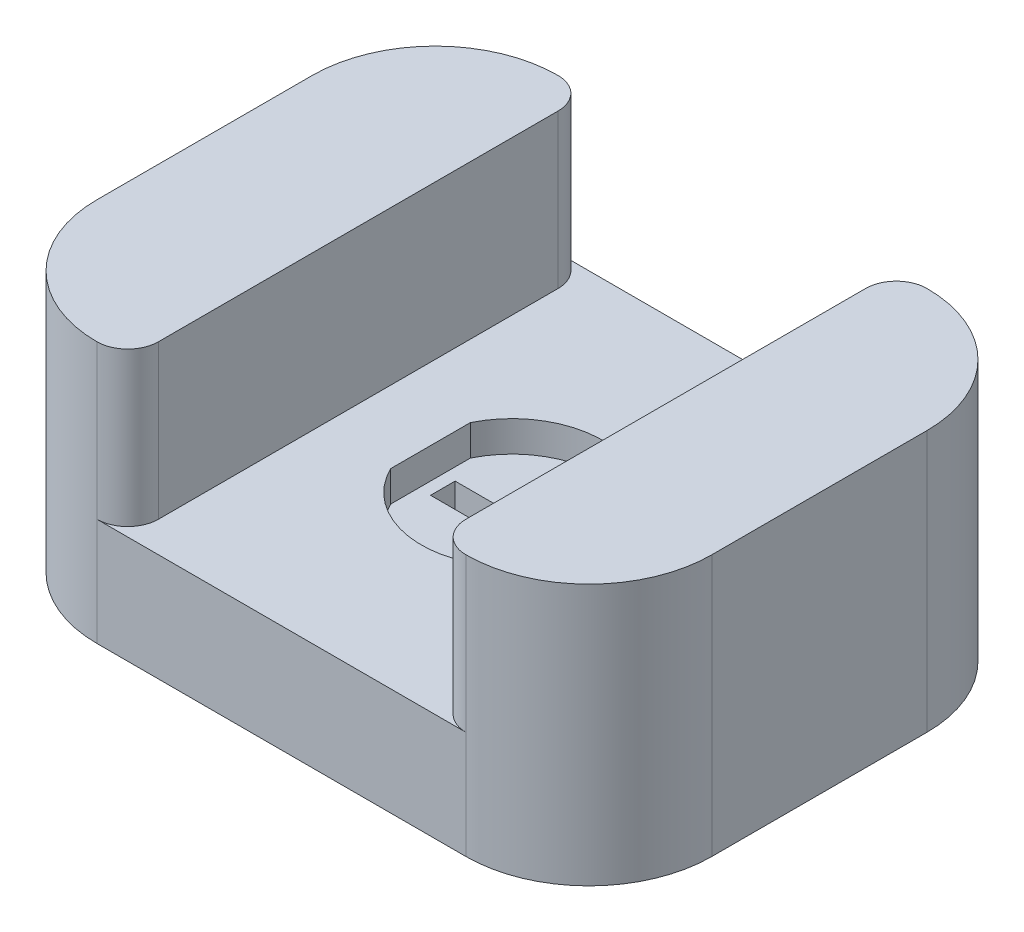
ISO-10303-21;
HEADER;
FILE_DESCRIPTION(('STEP AP214'),'2;1');
FILE_NAME('part.step','',(''),(''),'','','');
FILE_SCHEMA(('AUTOMOTIVE_DESIGN { 1 0 10303 214 1 1 1 1 }'));
ENDSEC;
DATA;
#1=APPLICATION_CONTEXT('core data for automotive mechanical design processes');
#2=APPLICATION_PROTOCOL_DEFINITION('international standard','automotive_design',2000,#1);
#3=PRODUCT_CONTEXT('',#1,'mechanical');
#4=PRODUCT('Part','Part','',(#3));
#5=PRODUCT_RELATED_PRODUCT_CATEGORY('part','',(#4));
#6=PRODUCT_DEFINITION_FORMATION('','',#4);
#7=PRODUCT_DEFINITION_CONTEXT('part definition',#1,'design');
#8=PRODUCT_DEFINITION('design','',#6,#7);
#9=PRODUCT_DEFINITION_SHAPE('','',#8);
#10=(LENGTH_UNIT() NAMED_UNIT(*) SI_UNIT(.MILLI.,.METRE.));
#11=(NAMED_UNIT(*) PLANE_ANGLE_UNIT() SI_UNIT($,.RADIAN.));
#12=(NAMED_UNIT(*) SI_UNIT($,.STERADIAN.) SOLID_ANGLE_UNIT());
#13=UNCERTAINTY_MEASURE_WITH_UNIT(LENGTH_MEASURE(1.E-05),#10,'distance_accuracy_value','');
#14=(GEOMETRIC_REPRESENTATION_CONTEXT(3) GLOBAL_UNCERTAINTY_ASSIGNED_CONTEXT((#13)) GLOBAL_UNIT_ASSIGNED_CONTEXT((#10,
#11,#12)) REPRESENTATION_CONTEXT('',''));
#15=CARTESIAN_POINT('',(0.,0.,0.));
#16=DIRECTION('',(0.,0.,1.));
#17=DIRECTION('',(1.,0.,0.));
#18=AXIS2_PLACEMENT_3D('',#15,#16,#17);
#19=CARTESIAN_POINT('',(0.,3.5,0.));
#20=DIRECTION('',(0.,1.,0.));
#21=DIRECTION('',(0.,0.,1.));
#22=AXIS2_PLACEMENT_3D('',#19,#20,#21);
#23=PLANE('',#22);
#24=CARTESIAN_POINT('',(0.,3.5,0.));
#25=DIRECTION('',(0.,1.,0.));
#26=DIRECTION('',(0.,0.,1.));
#27=AXIS2_PLACEMENT_3D('',#24,#25,#26);
#28=CIRCLE('',#27,2.95);
#29=CARTESIAN_POINT('',(-2.65,3.5,1.29614813968157));
#30=VERTEX_POINT('',#29);
#31=CARTESIAN_POINT('',(-2.65,3.5,-1.29614813968157));
#32=VERTEX_POINT('',#31);
#33=EDGE_CURVE('E279',#30,#32,#28,.T.);
#34=ORIENTED_EDGE('',*,*,#33,.F.);
#35=DIRECTION('',(0.,0.,1.));
#36=VECTOR('',#35,1.);
#37=CARTESIAN_POINT('',(-2.65,3.5,1.29614813968157));
#38=LINE('',#37,#36);
#39=EDGE_CURVE('E284',#32,#30,#38,.T.);
#40=ORIENTED_EDGE('',*,*,#39,.F.);
#41=EDGE_LOOP('',(#34,#40));
#42=FACE_BOUND('',#41,.T.);
#43=DIRECTION('',(-1.,0.,0.));
#44=VECTOR('',#43,1.);
#45=CARTESIAN_POINT('',(10.,3.5,-7.5));
#46=LINE('',#45,#44);
#47=CARTESIAN_POINT('',(6.,3.5,-7.5));
#48=VERTEX_POINT('',#47);
#49=CARTESIAN_POINT('',(-6.,3.5,-7.5));
#50=VERTEX_POINT('',#49);
#51=EDGE_CURVE('E298',#48,#50,#46,.T.);
#52=ORIENTED_EDGE('',*,*,#51,.T.);
#53=CARTESIAN_POINT('',(-6.00000000000001,3.5,-6.5));
#54=DIRECTION('',(0.,1.,0.));
#55=DIRECTION('',(0.,0.,1.));
#56=AXIS2_PLACEMENT_3D('',#53,#54,#55);
#57=CIRCLE('',#56,1.);
#58=CARTESIAN_POINT('',(-5.00000000000001,3.5,-6.5));
#59=VERTEX_POINT('',#58);
#60=EDGE_CURVE('E41',#50,#59,#57,.F.);
#61=ORIENTED_EDGE('',*,*,#60,.T.);
#62=DIRECTION('',(0.,0.,-1.));
#63=VECTOR('',#62,1.);
#64=CARTESIAN_POINT('',(-5.00000000000001,3.5,-7.5));
#65=LINE('',#64,#63);
#66=CARTESIAN_POINT('',(-5.,3.5,6.5));
#67=VERTEX_POINT('',#66);
#68=EDGE_CURVE('E216',#67,#59,#65,.T.);
#69=ORIENTED_EDGE('',*,*,#68,.F.);
#70=CARTESIAN_POINT('',(-6.,3.5,6.5));
#71=DIRECTION('',(0.,1.,0.));
#72=DIRECTION('',(0.,0.,1.));
#73=AXIS2_PLACEMENT_3D('',#70,#71,#72);
#74=CIRCLE('',#73,1.);
#75=CARTESIAN_POINT('',(-6.,3.5,7.5));
#76=VERTEX_POINT('',#75);
#77=EDGE_CURVE('E11',#67,#76,#74,.F.);
#78=ORIENTED_EDGE('',*,*,#77,.T.);
#79=DIRECTION('',(1.,0.,0.));
#80=VECTOR('',#79,1.);
#81=CARTESIAN_POINT('',(10.,3.5,7.5));
#82=LINE('',#81,#80);
#83=CARTESIAN_POINT('',(6.,3.5,7.5));
#84=VERTEX_POINT('',#83);
#85=EDGE_CURVE('E296',#76,#84,#82,.T.);
#86=ORIENTED_EDGE('',*,*,#85,.T.);
#87=CARTESIAN_POINT('',(6.,3.5,6.5));
#88=DIRECTION('',(0.,1.,0.));
#89=DIRECTION('',(0.,0.,1.));
#90=AXIS2_PLACEMENT_3D('',#87,#88,#89);
#91=CIRCLE('',#90,1.);
#92=CARTESIAN_POINT('',(5.,3.5,6.5));
#93=VERTEX_POINT('',#92);
#94=EDGE_CURVE('E366',#84,#93,#91,.F.);
#95=ORIENTED_EDGE('',*,*,#94,.T.);
#96=DIRECTION('',(0.,0.,1.));
#97=VECTOR('',#96,1.);
#98=CARTESIAN_POINT('',(5.,3.5,-7.5));
#99=LINE('',#98,#97);
#100=CARTESIAN_POINT('',(5.,3.5,-6.5));
#101=VERTEX_POINT('',#100);
#102=EDGE_CURVE('E222',#101,#93,#99,.T.);
#103=ORIENTED_EDGE('',*,*,#102,.F.);
#104=CARTESIAN_POINT('',(6.,3.5,-6.5));
#105=DIRECTION('',(0.,1.,0.));
#106=DIRECTION('',(0.,0.,1.));
#107=AXIS2_PLACEMENT_3D('',#104,#105,#106);
#108=CIRCLE('',#107,1.);
#109=EDGE_CURVE('E363',#101,#48,#108,.F.);
#110=ORIENTED_EDGE('',*,*,#109,.T.);
#111=EDGE_LOOP('',(#52,#61,#69,#78,#86,#95,#103,#110));
#112=FACE_BOUND('',#111,.T.);
#113=ADVANCED_FACE('F33',(#42,#112),#23,.T.);
#114=CARTESIAN_POINT('',(2.25,-0.00100000000000013,-0.4));
#115=DIRECTION('',(0.,0.,-1.));
#116=DIRECTION('',(-1.,0.,0.));
#117=AXIS2_PLACEMENT_3D('',#114,#115,#116);
#118=PLANE('',#117);
#119=DIRECTION('',(0.,1.,0.));
#120=VECTOR('',#119,1.);
#121=CARTESIAN_POINT('',(-2.25,-0.00100000000000013,-0.4));
#122=LINE('',#121,#120);
#123=CARTESIAN_POINT('',(-2.25,1.4,-0.4));
#124=VERTEX_POINT('',#123);
#125=CARTESIAN_POINT('',(-2.25,2.5,-0.4));
#126=VERTEX_POINT('',#125);
#127=EDGE_CURVE('E269',#124,#126,#122,.T.);
#128=ORIENTED_EDGE('',*,*,#127,.F.);
#129=DIRECTION('',(-1.,0.,0.));
#130=VECTOR('',#129,1.);
#131=CARTESIAN_POINT('',(2.25,1.4,-0.4));
#132=LINE('',#131,#130);
#133=CARTESIAN_POINT('',(2.25,1.4,-0.4));
#134=VERTEX_POINT('',#133);
#135=EDGE_CURVE('E342',#124,#134,#132,.F.);
#136=ORIENTED_EDGE('',*,*,#135,.T.);
#137=DIRECTION('',(0.,1.,0.));
#138=VECTOR('',#137,1.);
#139=CARTESIAN_POINT('',(2.25,-0.00100000000000013,-0.4));
#140=LINE('',#139,#138);
#141=CARTESIAN_POINT('',(2.25,2.5,-0.4));
#142=VERTEX_POINT('',#141);
#143=EDGE_CURVE('E272',#134,#142,#140,.T.);
#144=ORIENTED_EDGE('',*,*,#143,.T.);
#145=DIRECTION('',(-1.,0.,0.));
#146=VECTOR('',#145,1.);
#147=CARTESIAN_POINT('',(2.25,2.5,-0.4));
#148=LINE('',#147,#146);
#149=EDGE_CURVE('E265',#142,#126,#148,.T.);
#150=ORIENTED_EDGE('',*,*,#149,.T.);
#151=EDGE_LOOP('',(#128,#136,#144,#150));
#152=FACE_BOUND('',#151,.T.);
#153=ADVANCED_FACE('F441',(#152),#118,.F.);
#154=CARTESIAN_POINT('',(-10.,3.5,7.5));
#155=DIRECTION('',(1.,0.,0.));
#156=DIRECTION('',(0.,0.,-1.));
#157=AXIS2_PLACEMENT_3D('',#154,#155,#156);
#158=PLANE('',#157);
#159=DIRECTION('',(0.,-1.,0.));
#160=VECTOR('',#159,1.);
#161=CARTESIAN_POINT('',(-10.,3.5,3.5));
#162=LINE('',#161,#160);
#163=CARTESIAN_POINT('',(-10.,0.,3.5));
#164=VERTEX_POINT('',#163);
#165=CARTESIAN_POINT('',(-10.,8.5,3.5));
#166=VERTEX_POINT('',#165);
#167=EDGE_CURVE('E204',#164,#166,#162,.F.);
#168=ORIENTED_EDGE('',*,*,#167,.T.);
#169=DIRECTION('',(0.,0.,1.));
#170=VECTOR('',#169,1.);
#171=CARTESIAN_POINT('',(-10.,8.5,-3.5));
#172=LINE('',#171,#170);
#173=CARTESIAN_POINT('',(-10.,8.5,-3.5));
#174=VERTEX_POINT('',#173);
#175=EDGE_CURVE('E207',#174,#166,#172,.T.);
#176=ORIENTED_EDGE('',*,*,#175,.F.);
#177=DIRECTION('',(0.,-1.,0.));
#178=VECTOR('',#177,1.);
#179=CARTESIAN_POINT('',(-10.,3.5,-3.5));
#180=LINE('',#179,#178);
#181=CARTESIAN_POINT('',(-10.,0.,-3.5));
#182=VERTEX_POINT('',#181);
#183=EDGE_CURVE('E190',#174,#182,#180,.T.);
#184=ORIENTED_EDGE('',*,*,#183,.T.);
#185=DIRECTION('',(0.,0.,1.));
#186=VECTOR('',#185,1.);
#187=CARTESIAN_POINT('',(-10.,0.,7.5));
#188=LINE('',#187,#186);
#189=EDGE_CURVE('E293',#182,#164,#188,.T.);
#190=ORIENTED_EDGE('',*,*,#189,.T.);
#191=EDGE_LOOP('',(#168,#176,#184,#190));
#192=FACE_BOUND('',#191,.T.);
#193=ADVANCED_FACE('F208',(#192),#158,.F.);
#194=CARTESIAN_POINT('',(10.,3.5,7.5));
#195=DIRECTION('',(0.,0.,-1.));
#196=DIRECTION('',(-1.,0.,0.));
#197=AXIS2_PLACEMENT_3D('',#194,#195,#196);
#198=PLANE('',#197);
#199=DIRECTION('',(0.,-1.,0.));
#200=VECTOR('',#199,1.);
#201=CARTESIAN_POINT('',(6.,3.5,7.5));
#202=LINE('',#201,#200);
#203=CARTESIAN_POINT('',(6.,0.,7.5));
#204=VERTEX_POINT('',#203);
#205=EDGE_CURVE('E336',#204,#84,#202,.F.);
#206=ORIENTED_EDGE('',*,*,#205,.T.);
#207=ORIENTED_EDGE('',*,*,#85,.F.);
#208=DIRECTION('',(0.,-1.,0.));
#209=VECTOR('',#208,1.);
#210=CARTESIAN_POINT('',(-6.,3.5,7.5));
#211=LINE('',#210,#209);
#212=CARTESIAN_POINT('',(-6.,0.,7.5));
#213=VERTEX_POINT('',#212);
#214=EDGE_CURVE('E331',#76,#213,#211,.T.);
#215=ORIENTED_EDGE('',*,*,#214,.T.);
#216=DIRECTION('',(1.,0.,0.));
#217=VECTOR('',#216,1.);
#218=CARTESIAN_POINT('',(10.,0.,7.5));
#219=LINE('',#218,#217);
#220=EDGE_CURVE('E302',#213,#204,#219,.T.);
#221=ORIENTED_EDGE('',*,*,#220,.T.);
#222=EDGE_LOOP('',(#206,#207,#215,#221));
#223=FACE_BOUND('',#222,.T.);
#224=ADVANCED_FACE('F390',(#223),#198,.F.);
#225=CARTESIAN_POINT('',(10.,3.5,7.5));
#226=DIRECTION('',(-1.,0.,0.));
#227=DIRECTION('',(0.,0.,1.));
#228=AXIS2_PLACEMENT_3D('',#225,#226,#227);
#229=PLANE('',#228);
#230=DIRECTION('',(0.,0.,-1.));
#231=VECTOR('',#230,1.);
#232=CARTESIAN_POINT('',(10.,0.,7.5));
#233=LINE('',#232,#231);
#234=CARTESIAN_POINT('',(10.,0.,3.5));
#235=VERTEX_POINT('',#234);
#236=CARTESIAN_POINT('',(10.,0.,-3.5));
#237=VERTEX_POINT('',#236);
#238=EDGE_CURVE('E305',#235,#237,#233,.T.);
#239=ORIENTED_EDGE('',*,*,#238,.T.);
#240=DIRECTION('',(0.,-1.,0.));
#241=VECTOR('',#240,1.);
#242=CARTESIAN_POINT('',(10.,3.5,-3.5));
#243=LINE('',#242,#241);
#244=CARTESIAN_POINT('',(10.,8.5,-3.5));
#245=VERTEX_POINT('',#244);
#246=EDGE_CURVE('E329',#237,#245,#243,.F.);
#247=ORIENTED_EDGE('',*,*,#246,.T.);
#248=DIRECTION('',(0.,0.,-1.));
#249=VECTOR('',#248,1.);
#250=CARTESIAN_POINT('',(10.,8.5,3.5));
#251=LINE('',#250,#249);
#252=CARTESIAN_POINT('',(10.,8.5,3.5));
#253=VERTEX_POINT('',#252);
#254=EDGE_CURVE('E233',#253,#245,#251,.T.);
#255=ORIENTED_EDGE('',*,*,#254,.F.);
#256=DIRECTION('',(0.,-1.,0.));
#257=VECTOR('',#256,1.);
#258=CARTESIAN_POINT('',(10.,3.5,3.5));
#259=LINE('',#258,#257);
#260=EDGE_CURVE('E326',#253,#235,#259,.T.);
#261=ORIENTED_EDGE('',*,*,#260,.T.);
#262=EDGE_LOOP('',(#239,#247,#255,#261));
#263=FACE_BOUND('',#262,.T.);
#264=ADVANCED_FACE('F475',(#263),#229,.F.);
#265=CARTESIAN_POINT('',(10.,3.5,-7.5));
#266=DIRECTION('',(0.,0.,1.));
#267=DIRECTION('',(1.,0.,0.));
#268=AXIS2_PLACEMENT_3D('',#265,#266,#267);
#269=PLANE('',#268);
#270=ORIENTED_EDGE('',*,*,#51,.F.);
#271=DIRECTION('',(0.,-1.,0.));
#272=VECTOR('',#271,1.);
#273=CARTESIAN_POINT('',(6.,3.5,-7.5));
#274=LINE('',#273,#272);
#275=CARTESIAN_POINT('',(6.,0.,-7.5));
#276=VERTEX_POINT('',#275);
#277=EDGE_CURVE('E318',#48,#276,#274,.T.);
#278=ORIENTED_EDGE('',*,*,#277,.T.);
#279=DIRECTION('',(-1.,0.,0.));
#280=VECTOR('',#279,1.);
#281=CARTESIAN_POINT('',(10.,0.,-7.5));
#282=LINE('',#281,#280);
#283=CARTESIAN_POINT('',(2.25,0.,-7.5));
#284=VERTEX_POINT('',#283);
#285=EDGE_CURVE('E299',#276,#284,#282,.T.);
#286=ORIENTED_EDGE('',*,*,#285,.T.);
#287=DIRECTION('',(0.,-1.,0.));
#288=VECTOR('',#287,1.);
#289=CARTESIAN_POINT('',(2.25,0.4,-7.5));
#290=LINE('',#289,#288);
#291=CARTESIAN_POINT('',(2.25,0.4,-7.5));
#292=VERTEX_POINT('',#291);
#293=EDGE_CURVE('E247',#292,#284,#290,.T.);
#294=ORIENTED_EDGE('',*,*,#293,.F.);
#295=DIRECTION('',(1.,0.,0.));
#296=VECTOR('',#295,1.);
#297=CARTESIAN_POINT('',(-2.25,0.4,-7.5));
#298=LINE('',#297,#296);
#299=CARTESIAN_POINT('',(-2.25,0.4,-7.5));
#300=VERTEX_POINT('',#299);
#301=EDGE_CURVE('E240',#300,#292,#298,.T.);
#302=ORIENTED_EDGE('',*,*,#301,.F.);
#303=DIRECTION('',(0.,-1.,0.));
#304=VECTOR('',#303,1.);
#305=CARTESIAN_POINT('',(-2.25,0.4,-7.5));
#306=LINE('',#305,#304);
#307=CARTESIAN_POINT('',(-2.25,0.,-7.5));
#308=VERTEX_POINT('',#307);
#309=EDGE_CURVE('E246',#300,#308,#306,.T.);
#310=ORIENTED_EDGE('',*,*,#309,.T.);
#311=CARTESIAN_POINT('',(-6.,0.,-7.5));
#312=VERTEX_POINT('',#311);
#313=EDGE_CURVE('E308',#308,#312,#282,.T.);
#314=ORIENTED_EDGE('',*,*,#313,.T.);
#315=DIRECTION('',(0.,-1.,0.));
#316=VECTOR('',#315,1.);
#317=CARTESIAN_POINT('',(-6.,3.5,-7.5));
#318=LINE('',#317,#316);
#319=EDGE_CURVE('E323',#312,#50,#318,.F.);
#320=ORIENTED_EDGE('',*,*,#319,.T.);
#321=EDGE_LOOP('',(#270,#278,#286,#294,#302,#310,#314,#320));
#322=FACE_BOUND('',#321,.T.);
#323=ADVANCED_FACE('F375',(#322),#269,.F.);
#324=CARTESIAN_POINT('',(0.,0.,0.));
#325=DIRECTION('',(0.,1.,0.));
#326=DIRECTION('',(0.,0.,1.));
#327=AXIS2_PLACEMENT_3D('',#324,#325,#326);
#328=PLANE('',#327);
#329=ORIENTED_EDGE('',*,*,#313,.F.);
#330=DIRECTION('',(0.,0.,-1.));
#331=VECTOR('',#330,1.);
#332=CARTESIAN_POINT('',(-2.25,0.,0.4));
#333=LINE('',#332,#331);
#334=CARTESIAN_POINT('',(-2.25,0.,0.4));
#335=VERTEX_POINT('',#334);
#336=EDGE_CURVE('E254',#335,#308,#333,.T.);
#337=ORIENTED_EDGE('',*,*,#336,.F.);
#338=DIRECTION('',(-1.,0.,0.));
#339=VECTOR('',#338,1.);
#340=CARTESIAN_POINT('',(2.25,0.,0.4));
#341=LINE('',#340,#339);
#342=CARTESIAN_POINT('',(2.25,0.,0.4));
#343=VERTEX_POINT('',#342);
#344=EDGE_CURVE('E271',#343,#335,#341,.T.);
#345=ORIENTED_EDGE('',*,*,#344,.F.);
#346=DIRECTION('',(0.,0.,1.));
#347=VECTOR('',#346,1.);
#348=CARTESIAN_POINT('',(2.25,0.,0.4));
#349=LINE('',#348,#347);
#350=EDGE_CURVE('E250',#284,#343,#349,.T.);
#351=ORIENTED_EDGE('',*,*,#350,.F.);
#352=ORIENTED_EDGE('',*,*,#285,.F.);
#353=CARTESIAN_POINT('',(6.,0.,-3.5));
#354=DIRECTION('',(0.,1.,0.));
#355=DIRECTION('',(0.,0.,1.));
#356=AXIS2_PLACEMENT_3D('',#353,#354,#355);
#357=CIRCLE('',#356,4.);
#358=EDGE_CURVE('E315',#276,#237,#357,.F.);
#359=ORIENTED_EDGE('',*,*,#358,.T.);
#360=ORIENTED_EDGE('',*,*,#238,.F.);
#361=CARTESIAN_POINT('',(6.,0.,3.5));
#362=DIRECTION('',(0.,1.,0.));
#363=DIRECTION('',(0.,0.,1.));
#364=AXIS2_PLACEMENT_3D('',#361,#362,#363);
#365=CIRCLE('',#364,4.);
#366=EDGE_CURVE('E313',#235,#204,#365,.F.);
#367=ORIENTED_EDGE('',*,*,#366,.T.);
#368=ORIENTED_EDGE('',*,*,#220,.F.);
#369=CARTESIAN_POINT('',(-6.,0.,3.5));
#370=DIRECTION('',(0.,1.,0.));
#371=DIRECTION('',(0.,0.,1.));
#372=AXIS2_PLACEMENT_3D('',#369,#370,#371);
#373=CIRCLE('',#372,4.);
#374=EDGE_CURVE('E203',#213,#164,#373,.F.);
#375=ORIENTED_EDGE('',*,*,#374,.T.);
#376=ORIENTED_EDGE('',*,*,#189,.F.);
#377=CARTESIAN_POINT('',(-6.,0.,-3.5));
#378=DIRECTION('',(0.,1.,0.));
#379=DIRECTION('',(0.,0.,1.));
#380=AXIS2_PLACEMENT_3D('',#377,#378,#379);
#381=CIRCLE('',#380,4.);
#382=EDGE_CURVE('E199',#182,#312,#381,.F.);
#383=ORIENTED_EDGE('',*,*,#382,.T.);
#384=EDGE_LOOP('',(#329,#337,#345,#351,#352,#359,#360,#367,#368,#375,#376,#383));
#385=FACE_BOUND('',#384,.T.);
#386=ADVANCED_FACE('F381',(#385),#328,.F.);
#387=CARTESIAN_POINT('',(0.,2.5,0.));
#388=DIRECTION('',(0.,1.,0.));
#389=DIRECTION('',(0.,0.,1.));
#390=AXIS2_PLACEMENT_3D('',#387,#388,#389);
#391=CYLINDRICAL_SURFACE('',#390,2.95);
#392=ORIENTED_EDGE('',*,*,#33,.T.);
#393=DIRECTION('',(0.,1.,0.));
#394=VECTOR('',#393,1.);
#395=CARTESIAN_POINT('',(-2.65,2.5,-1.29614813968157));
#396=LINE('',#395,#394);
#397=CARTESIAN_POINT('',(-2.65,2.5,-1.29614813968157));
#398=VERTEX_POINT('',#397);
#399=EDGE_CURVE('E287',#398,#32,#396,.T.);
#400=ORIENTED_EDGE('',*,*,#399,.F.);
#401=CARTESIAN_POINT('',(0.,2.5,0.));
#402=DIRECTION('',(0.,1.,0.));
#403=DIRECTION('',(0.,0.,1.));
#404=AXIS2_PLACEMENT_3D('',#401,#402,#403);
#405=CIRCLE('',#404,2.95);
#406=CARTESIAN_POINT('',(-2.65,2.5,1.29614813968157));
#407=VERTEX_POINT('',#406);
#408=EDGE_CURVE('E280',#407,#398,#405,.T.);
#409=ORIENTED_EDGE('',*,*,#408,.F.);
#410=DIRECTION('',(0.,1.,0.));
#411=VECTOR('',#410,1.);
#412=CARTESIAN_POINT('',(-2.65,2.5,1.29614813968157));
#413=LINE('',#412,#411);
#414=EDGE_CURVE('E291',#407,#30,#413,.T.);
#415=ORIENTED_EDGE('',*,*,#414,.T.);
#416=EDGE_LOOP('',(#392,#400,#409,#415));
#417=FACE_BOUND('',#416,.T.);
#418=ADVANCED_FACE('F469',(#417),#391,.F.);
#419=CARTESIAN_POINT('',(-2.65,2.5,1.29614813968157));
#420=DIRECTION('',(-1.,0.,0.));
#421=DIRECTION('',(0.,0.,1.));
#422=AXIS2_PLACEMENT_3D('',#419,#420,#421);
#423=PLANE('',#422);
#424=ORIENTED_EDGE('',*,*,#39,.T.);
#425=ORIENTED_EDGE('',*,*,#414,.F.);
#426=DIRECTION('',(0.,0.,1.));
#427=VECTOR('',#426,1.);
#428=CARTESIAN_POINT('',(-2.65,2.5,1.29614813968157));
#429=LINE('',#428,#427);
#430=EDGE_CURVE('E283',#398,#407,#429,.T.);
#431=ORIENTED_EDGE('',*,*,#430,.F.);
#432=ORIENTED_EDGE('',*,*,#399,.T.);
#433=EDGE_LOOP('',(#424,#425,#431,#432));
#434=FACE_BOUND('',#433,.T.);
#435=ADVANCED_FACE('F667',(#434),#423,.F.);
#436=CARTESIAN_POINT('',(0.,2.5,0.));
#437=DIRECTION('',(0.,1.,0.));
#438=DIRECTION('',(0.,0.,1.));
#439=AXIS2_PLACEMENT_3D('',#436,#437,#438);
#440=PLANE('',#439);
#441=DIRECTION('',(0.,0.,1.));
#442=VECTOR('',#441,1.);
#443=CARTESIAN_POINT('',(-2.25,2.5,0.4));
#444=LINE('',#443,#442);
#445=CARTESIAN_POINT('',(-2.25,2.5,0.4));
#446=VERTEX_POINT('',#445);
#447=EDGE_CURVE('E256',#126,#446,#444,.T.);
#448=ORIENTED_EDGE('',*,*,#447,.F.);
#449=ORIENTED_EDGE('',*,*,#149,.F.);
#450=DIRECTION('',(0.,0.,-1.));
#451=VECTOR('',#450,1.);
#452=CARTESIAN_POINT('',(2.25,2.5,0.4));
#453=LINE('',#452,#451);
#454=CARTESIAN_POINT('',(2.25,2.5,0.4));
#455=VERTEX_POINT('',#454);
#456=EDGE_CURVE('E262',#455,#142,#453,.T.);
#457=ORIENTED_EDGE('',*,*,#456,.F.);
#458=DIRECTION('',(1.,0.,0.));
#459=VECTOR('',#458,1.);
#460=CARTESIAN_POINT('',(2.25,2.5,0.4));
#461=LINE('',#460,#459);
#462=EDGE_CURVE('E259',#446,#455,#461,.T.);
#463=ORIENTED_EDGE('',*,*,#462,.F.);
#464=EDGE_LOOP('',(#448,#449,#457,#463));
#465=FACE_BOUND('',#464,.T.);
#466=ORIENTED_EDGE('',*,*,#408,.T.);
#467=ORIENTED_EDGE('',*,*,#430,.T.);
#468=EDGE_LOOP('',(#466,#467));
#469=FACE_BOUND('',#468,.T.);
#470=ADVANCED_FACE('F437',(#465,#469),#440,.T.);
#471=CARTESIAN_POINT('',(-2.25,-0.00100000000000013,0.4));
#472=DIRECTION('',(-1.,0.,0.));
#473=DIRECTION('',(0.,0.,1.));
#474=AXIS2_PLACEMENT_3D('',#471,#472,#473);
#475=PLANE('',#474);
#476=ORIENTED_EDGE('',*,*,#336,.T.);
#477=ORIENTED_EDGE('',*,*,#309,.F.);
#478=DIRECTION('',(0.,0.,-1.));
#479=VECTOR('',#478,1.);
#480=CARTESIAN_POINT('',(-2.25,0.4,-0.4));
#481=LINE('',#480,#479);
#482=CARTESIAN_POINT('',(-2.25,0.4,-1.4));
#483=VERTEX_POINT('',#482);
#484=EDGE_CURVE('E236',#483,#300,#481,.T.);
#485=ORIENTED_EDGE('',*,*,#484,.F.);
#486=CARTESIAN_POINT('',(-2.25,1.4,-1.4));
#487=DIRECTION('',(-1.,0.,0.));
#488=DIRECTION('',(0.,0.,1.));
#489=AXIS2_PLACEMENT_3D('',#486,#487,#488);
#490=CIRCLE('',#489,1.);
#491=EDGE_CURVE('E344',#483,#124,#490,.T.);
#492=ORIENTED_EDGE('',*,*,#491,.T.);
#493=ORIENTED_EDGE('',*,*,#127,.T.);
#494=ORIENTED_EDGE('',*,*,#447,.T.);
#495=DIRECTION('',(0.,1.,0.));
#496=VECTOR('',#495,1.);
#497=CARTESIAN_POINT('',(-2.25,-0.00100000000000013,0.4));
#498=LINE('',#497,#496);
#499=EDGE_CURVE('E268',#335,#446,#498,.T.);
#500=ORIENTED_EDGE('',*,*,#499,.F.);
#501=EDGE_LOOP('',(#476,#477,#485,#492,#493,#494,#500));
#502=FACE_BOUND('',#501,.T.);
#503=ADVANCED_FACE('F429',(#502),#475,.F.);
#504=CARTESIAN_POINT('',(2.25,-0.00100000000000013,0.4));
#505=DIRECTION('',(1.,0.,0.));
#506=DIRECTION('',(0.,0.,-1.));
#507=AXIS2_PLACEMENT_3D('',#504,#505,#506);
#508=PLANE('',#507);
#509=ORIENTED_EDGE('',*,*,#350,.T.);
#510=DIRECTION('',(0.,1.,0.));
#511=VECTOR('',#510,1.);
#512=CARTESIAN_POINT('',(2.25,-0.00100000000000013,0.4));
#513=LINE('',#512,#511);
#514=EDGE_CURVE('E274',#343,#455,#513,.T.);
#515=ORIENTED_EDGE('',*,*,#514,.T.);
#516=ORIENTED_EDGE('',*,*,#456,.T.);
#517=ORIENTED_EDGE('',*,*,#143,.F.);
#518=CARTESIAN_POINT('',(2.25,1.4,-1.4));
#519=DIRECTION('',(1.,0.,0.));
#520=DIRECTION('',(0.,0.,-1.));
#521=AXIS2_PLACEMENT_3D('',#518,#519,#520);
#522=CIRCLE('',#521,1.);
#523=CARTESIAN_POINT('',(2.25,0.4,-1.4));
#524=VERTEX_POINT('',#523);
#525=EDGE_CURVE('E346',#134,#524,#522,.T.);
#526=ORIENTED_EDGE('',*,*,#525,.T.);
#527=DIRECTION('',(0.,0.,1.));
#528=VECTOR('',#527,1.);
#529=CARTESIAN_POINT('',(2.25,0.4,-0.4));
#530=LINE('',#529,#528);
#531=EDGE_CURVE('E243',#292,#524,#530,.T.);
#532=ORIENTED_EDGE('',*,*,#531,.F.);
#533=ORIENTED_EDGE('',*,*,#293,.T.);
#534=EDGE_LOOP('',(#509,#515,#516,#517,#526,#532,#533));
#535=FACE_BOUND('',#534,.T.);
#536=ADVANCED_FACE('F421',(#535),#508,.F.);
#537=CARTESIAN_POINT('',(2.25,-0.00100000000000013,0.4));
#538=DIRECTION('',(0.,0.,1.));
#539=DIRECTION('',(1.,0.,0.));
#540=AXIS2_PLACEMENT_3D('',#537,#538,#539);
#541=PLANE('',#540);
#542=ORIENTED_EDGE('',*,*,#344,.T.);
#543=ORIENTED_EDGE('',*,*,#499,.T.);
#544=ORIENTED_EDGE('',*,*,#462,.T.);
#545=ORIENTED_EDGE('',*,*,#514,.F.);
#546=EDGE_LOOP('',(#542,#543,#544,#545));
#547=FACE_BOUND('',#546,.T.);
#548=ADVANCED_FACE('F433',(#547),#541,.F.);
#549=CARTESIAN_POINT('',(-6.,3.5,-3.5));
#550=DIRECTION('',(0.,-1.,0.));
#551=DIRECTION('',(0.,0.,-1.));
#552=AXIS2_PLACEMENT_3D('',#549,#550,#551);
#553=CYLINDRICAL_SURFACE('',#552,4.);
#554=ORIENTED_EDGE('',*,*,#183,.F.);
#555=CARTESIAN_POINT('',(-6.,8.5,-3.5));
#556=DIRECTION('',(0.,1.,0.));
#557=DIRECTION('',(0.,0.,1.));
#558=AXIS2_PLACEMENT_3D('',#555,#556,#557);
#559=CIRCLE('',#558,4.);
#560=CARTESIAN_POINT('',(-6.,8.5,-7.5));
#561=VERTEX_POINT('',#560);
#562=EDGE_CURVE('E195',#561,#174,#559,.T.);
#563=ORIENTED_EDGE('',*,*,#562,.F.);
#564=EDGE_CURVE('E322',#50,#561,#318,.F.);
#565=ORIENTED_EDGE('',*,*,#564,.F.);
#566=ORIENTED_EDGE('',*,*,#319,.F.);
#567=ORIENTED_EDGE('',*,*,#382,.F.);
#568=EDGE_LOOP('',(#554,#563,#565,#566,#567));
#569=FACE_BOUND('',#568,.T.);
#570=ADVANCED_FACE('F192',(#569),#553,.T.);
#571=CARTESIAN_POINT('',(6.,3.5,-3.5));
#572=DIRECTION('',(0.,-1.,0.));
#573=DIRECTION('',(0.,0.,-1.));
#574=AXIS2_PLACEMENT_3D('',#571,#572,#573);
#575=CYLINDRICAL_SURFACE('',#574,4.);
#576=CARTESIAN_POINT('',(6.,8.5,-7.5));
#577=VERTEX_POINT('',#576);
#578=EDGE_CURVE('E319',#577,#48,#274,.T.);
#579=ORIENTED_EDGE('',*,*,#578,.F.);
#580=CARTESIAN_POINT('',(6.,8.5,-3.5));
#581=DIRECTION('',(0.,1.,0.));
#582=DIRECTION('',(0.,0.,1.));
#583=AXIS2_PLACEMENT_3D('',#580,#581,#582);
#584=CIRCLE('',#583,4.);
#585=EDGE_CURVE('E224',#245,#577,#584,.T.);
#586=ORIENTED_EDGE('',*,*,#585,.F.);
#587=ORIENTED_EDGE('',*,*,#246,.F.);
#588=ORIENTED_EDGE('',*,*,#358,.F.);
#589=ORIENTED_EDGE('',*,*,#277,.F.);
#590=EDGE_LOOP('',(#579,#586,#587,#588,#589));
#591=FACE_BOUND('',#590,.T.);
#592=ADVANCED_FACE('F412',(#591),#575,.T.);
#593=CARTESIAN_POINT('',(6.,3.5,3.5));
#594=DIRECTION('',(0.,-1.,0.));
#595=DIRECTION('',(0.,0.,-1.));
#596=AXIS2_PLACEMENT_3D('',#593,#594,#595);
#597=CYLINDRICAL_SURFACE('',#596,4.);
#598=ORIENTED_EDGE('',*,*,#260,.F.);
#599=CARTESIAN_POINT('',(6.,8.5,3.5));
#600=DIRECTION('',(0.,1.,0.));
#601=DIRECTION('',(0.,0.,1.));
#602=AXIS2_PLACEMENT_3D('',#599,#600,#601);
#603=CIRCLE('',#602,4.);
#604=CARTESIAN_POINT('',(6.,8.5,7.5));
#605=VERTEX_POINT('',#604);
#606=EDGE_CURVE('E230',#605,#253,#603,.T.);
#607=ORIENTED_EDGE('',*,*,#606,.F.);
#608=EDGE_CURVE('E335',#84,#605,#202,.F.);
#609=ORIENTED_EDGE('',*,*,#608,.F.);
#610=ORIENTED_EDGE('',*,*,#205,.F.);
#611=ORIENTED_EDGE('',*,*,#366,.F.);
#612=EDGE_LOOP('',(#598,#607,#609,#610,#611));
#613=FACE_BOUND('',#612,.T.);
#614=ADVANCED_FACE('F394',(#613),#597,.T.);
#615=CARTESIAN_POINT('',(-6.,3.5,3.5));
#616=DIRECTION('',(0.,-1.,0.));
#617=DIRECTION('',(0.,0.,-1.));
#618=AXIS2_PLACEMENT_3D('',#615,#616,#617);
#619=CYLINDRICAL_SURFACE('',#618,4.);
#620=CARTESIAN_POINT('',(-6.,8.5,7.5));
#621=VERTEX_POINT('',#620);
#622=EDGE_CURVE('E332',#621,#76,#211,.T.);
#623=ORIENTED_EDGE('',*,*,#622,.F.);
#624=CARTESIAN_POINT('',(-6.,8.5,3.5));
#625=DIRECTION('',(0.,1.,0.));
#626=DIRECTION('',(0.,0.,1.));
#627=AXIS2_PLACEMENT_3D('',#624,#625,#626);
#628=CIRCLE('',#627,4.);
#629=EDGE_CURVE('E211',#166,#621,#628,.T.);
#630=ORIENTED_EDGE('',*,*,#629,.F.);
#631=ORIENTED_EDGE('',*,*,#167,.F.);
#632=ORIENTED_EDGE('',*,*,#374,.F.);
#633=ORIENTED_EDGE('',*,*,#214,.F.);
#634=EDGE_LOOP('',(#623,#630,#631,#632,#633));
#635=FACE_BOUND('',#634,.T.);
#636=ADVANCED_FACE('F385',(#635),#619,.T.);
#637=CARTESIAN_POINT('',(0.,0.4,0.));
#638=DIRECTION('',(0.,-1.,0.));
#639=DIRECTION('',(0.,0.,-1.));
#640=AXIS2_PLACEMENT_3D('',#637,#638,#639);
#641=PLANE('',#640);
#642=ORIENTED_EDGE('',*,*,#531,.T.);
#643=DIRECTION('',(-1.,0.,0.));
#644=VECTOR('',#643,1.);
#645=CARTESIAN_POINT('',(-2.25,0.4,-1.4));
#646=LINE('',#645,#644);
#647=EDGE_CURVE('E339',#524,#483,#646,.T.);
#648=ORIENTED_EDGE('',*,*,#647,.T.);
#649=ORIENTED_EDGE('',*,*,#484,.T.);
#650=ORIENTED_EDGE('',*,*,#301,.T.);
#651=EDGE_LOOP('',(#642,#648,#649,#650));
#652=FACE_BOUND('',#651,.T.);
#653=ADVANCED_FACE('F426',(#652),#641,.T.);
#654=CARTESIAN_POINT('',(0.,1.4,-1.4));
#655=DIRECTION('',(1.,0.,0.));
#656=DIRECTION('',(0.,0.,-1.));
#657=AXIS2_PLACEMENT_3D('',#654,#655,#656);
#658=CYLINDRICAL_SURFACE('',#657,1.);
#659=ORIENTED_EDGE('',*,*,#525,.F.);
#660=ORIENTED_EDGE('',*,*,#135,.F.);
#661=ORIENTED_EDGE('',*,*,#491,.F.);
#662=ORIENTED_EDGE('',*,*,#647,.F.);
#663=EDGE_LOOP('',(#659,#660,#661,#662));
#664=FACE_BOUND('',#663,.T.);
#665=ADVANCED_FACE('F444',(#664),#658,.T.);
#666=CARTESIAN_POINT('',(5.,8.5,-7.5));
#667=DIRECTION('',(1.,0.,0.));
#668=DIRECTION('',(0.,0.,-1.));
#669=AXIS2_PLACEMENT_3D('',#666,#667,#668);
#670=PLANE('',#669);
#671=DIRECTION('',(0.,0.,1.));
#672=VECTOR('',#671,1.);
#673=CARTESIAN_POINT('',(5.,8.5,-7.5));
#674=LINE('',#673,#672);
#675=CARTESIAN_POINT('',(5.,8.5,-6.5));
#676=VERTEX_POINT('',#675);
#677=CARTESIAN_POINT('',(5.,8.5,6.5));
#678=VERTEX_POINT('',#677);
#679=EDGE_CURVE('E227',#676,#678,#674,.T.);
#680=ORIENTED_EDGE('',*,*,#679,.F.);
#681=DIRECTION('',(0.,-1.,0.));
#682=VECTOR('',#681,1.);
#683=CARTESIAN_POINT('',(5.,8.5,-6.5));
#684=LINE('',#683,#682);
#685=EDGE_CURVE('E350',#676,#101,#684,.T.);
#686=ORIENTED_EDGE('',*,*,#685,.T.);
#687=ORIENTED_EDGE('',*,*,#102,.T.);
#688=DIRECTION('',(0.,-1.,0.));
#689=VECTOR('',#688,1.);
#690=CARTESIAN_POINT('',(5.,8.5,6.5));
#691=LINE('',#690,#689);
#692=EDGE_CURVE('E348',#93,#678,#691,.F.);
#693=ORIENTED_EDGE('',*,*,#692,.T.);
#694=EDGE_LOOP('',(#680,#686,#687,#693));
#695=FACE_BOUND('',#694,.T.);
#696=ADVANCED_FACE('F404',(#695),#670,.F.);
#697=CARTESIAN_POINT('',(6.,8.5,-3.5));
#698=DIRECTION('',(0.,1.,0.));
#699=DIRECTION('',(0.,0.,1.));
#700=AXIS2_PLACEMENT_3D('',#697,#698,#699);
#701=PLANE('',#700);
#702=ORIENTED_EDGE('',*,*,#585,.T.);
#703=CARTESIAN_POINT('',(6.,8.5,-6.5));
#704=DIRECTION('',(0.,1.,0.));
#705=DIRECTION('',(0.,0.,1.));
#706=AXIS2_PLACEMENT_3D('',#703,#704,#705);
#707=CIRCLE('',#706,1.);
#708=EDGE_CURVE('E355',#577,#676,#707,.T.);
#709=ORIENTED_EDGE('',*,*,#708,.T.);
#710=ORIENTED_EDGE('',*,*,#679,.T.);
#711=CARTESIAN_POINT('',(6.,8.5,6.5));
#712=DIRECTION('',(0.,1.,0.));
#713=DIRECTION('',(0.,0.,1.));
#714=AXIS2_PLACEMENT_3D('',#711,#712,#713);
#715=CIRCLE('',#714,1.);
#716=EDGE_CURVE('E353',#678,#605,#715,.T.);
#717=ORIENTED_EDGE('',*,*,#716,.T.);
#718=ORIENTED_EDGE('',*,*,#606,.T.);
#719=ORIENTED_EDGE('',*,*,#254,.T.);
#720=EDGE_LOOP('',(#702,#709,#710,#717,#718,#719));
#721=FACE_BOUND('',#720,.T.);
#722=ADVANCED_FACE('F452',(#721),#701,.T.);
#723=CARTESIAN_POINT('',(-5.00000000000001,8.5,-7.5));
#724=DIRECTION('',(-1.,0.,0.));
#725=DIRECTION('',(0.,0.,1.));
#726=AXIS2_PLACEMENT_3D('',#723,#724,#725);
#727=PLANE('',#726);
#728=ORIENTED_EDGE('',*,*,#68,.T.);
#729=DIRECTION('',(0.,-1.,0.));
#730=VECTOR('',#729,1.);
#731=CARTESIAN_POINT('',(-5.00000000000001,8.5,-6.5));
#732=LINE('',#731,#730);
#733=CARTESIAN_POINT('',(-5.00000000000001,8.5,-6.5));
#734=VERTEX_POINT('',#733);
#735=EDGE_CURVE('E48',#59,#734,#732,.F.);
#736=ORIENTED_EDGE('',*,*,#735,.T.);
#737=DIRECTION('',(0.,0.,-1.));
#738=VECTOR('',#737,1.);
#739=CARTESIAN_POINT('',(-5.00000000000001,8.5,-7.5));
#740=LINE('',#739,#738);
#741=CARTESIAN_POINT('',(-5.,8.5,6.5));
#742=VERTEX_POINT('',#741);
#743=EDGE_CURVE('E221',#742,#734,#740,.T.);
#744=ORIENTED_EDGE('',*,*,#743,.F.);
#745=DIRECTION('',(0.,-1.,0.));
#746=VECTOR('',#745,1.);
#747=CARTESIAN_POINT('',(-5.,8.5,6.5));
#748=LINE('',#747,#746);
#749=EDGE_CURVE('E357',#742,#67,#748,.T.);
#750=ORIENTED_EDGE('',*,*,#749,.T.);
#751=EDGE_LOOP('',(#728,#736,#744,#750));
#752=FACE_BOUND('',#751,.T.);
#753=ADVANCED_FACE('F371',(#752),#727,.F.);
#754=CARTESIAN_POINT('',(-6.,8.5,-3.5));
#755=DIRECTION('',(0.,1.,0.));
#756=DIRECTION('',(0.,0.,1.));
#757=AXIS2_PLACEMENT_3D('',#754,#755,#756);
#758=PLANE('',#757);
#759=ORIENTED_EDGE('',*,*,#743,.T.);
#760=CARTESIAN_POINT('',(-6.00000000000001,8.5,-6.5));
#761=DIRECTION('',(0.,1.,0.));
#762=DIRECTION('',(0.,0.,1.));
#763=AXIS2_PLACEMENT_3D('',#760,#761,#762);
#764=CIRCLE('',#763,1.);
#765=EDGE_CURVE('E215',#734,#561,#764,.T.);
#766=ORIENTED_EDGE('',*,*,#765,.T.);
#767=ORIENTED_EDGE('',*,*,#562,.T.);
#768=ORIENTED_EDGE('',*,*,#175,.T.);
#769=ORIENTED_EDGE('',*,*,#629,.T.);
#770=CARTESIAN_POINT('',(-6.,8.5,6.5));
#771=DIRECTION('',(0.,1.,0.));
#772=DIRECTION('',(0.,0.,1.));
#773=AXIS2_PLACEMENT_3D('',#770,#771,#772);
#774=CIRCLE('',#773,1.);
#775=EDGE_CURVE('E55',#621,#742,#774,.T.);
#776=ORIENTED_EDGE('',*,*,#775,.T.);
#777=EDGE_LOOP('',(#759,#766,#767,#768,#769,#776));
#778=FACE_BOUND('',#777,.T.);
#779=ADVANCED_FACE('F213',(#778),#758,.T.);
#780=CARTESIAN_POINT('',(6.,8.5,-6.5));
#781=DIRECTION('',(0.,-1.,0.));
#782=DIRECTION('',(0.,0.,-1.));
#783=AXIS2_PLACEMENT_3D('',#780,#781,#782);
#784=CYLINDRICAL_SURFACE('',#783,1.);
#785=ORIENTED_EDGE('',*,*,#708,.F.);
#786=ORIENTED_EDGE('',*,*,#578,.T.);
#787=ORIENTED_EDGE('',*,*,#109,.F.);
#788=ORIENTED_EDGE('',*,*,#685,.F.);
#789=EDGE_LOOP('',(#785,#786,#787,#788));
#790=FACE_BOUND('',#789,.T.);
#791=ADVANCED_FACE('F408',(#790),#784,.T.);
#792=CARTESIAN_POINT('',(6.,3.5,6.5));
#793=DIRECTION('',(0.,-1.,0.));
#794=DIRECTION('',(0.,0.,-1.));
#795=AXIS2_PLACEMENT_3D('',#792,#793,#794);
#796=CYLINDRICAL_SURFACE('',#795,1.);
#797=ORIENTED_EDGE('',*,*,#716,.F.);
#798=ORIENTED_EDGE('',*,*,#692,.F.);
#799=ORIENTED_EDGE('',*,*,#94,.F.);
#800=ORIENTED_EDGE('',*,*,#608,.T.);
#801=EDGE_LOOP('',(#797,#798,#799,#800));
#802=FACE_BOUND('',#801,.T.);
#803=ADVANCED_FACE('F399',(#802),#796,.T.);
#804=CARTESIAN_POINT('',(-6.00000000000001,3.5,-6.5));
#805=DIRECTION('',(0.,-1.,0.));
#806=DIRECTION('',(0.,0.,-1.));
#807=AXIS2_PLACEMENT_3D('',#804,#805,#806);
#808=CYLINDRICAL_SURFACE('',#807,1.);
#809=ORIENTED_EDGE('',*,*,#765,.F.);
#810=ORIENTED_EDGE('',*,*,#735,.F.);
#811=ORIENTED_EDGE('',*,*,#60,.F.);
#812=ORIENTED_EDGE('',*,*,#564,.T.);
#813=EDGE_LOOP('',(#809,#810,#811,#812));
#814=FACE_BOUND('',#813,.T.);
#815=ADVANCED_FACE('F373',(#814),#808,.T.);
#816=CARTESIAN_POINT('',(-6.,8.5,6.5));
#817=DIRECTION('',(0.,-1.,0.));
#818=DIRECTION('',(0.,0.,-1.));
#819=AXIS2_PLACEMENT_3D('',#816,#817,#818);
#820=CYLINDRICAL_SURFACE('',#819,1.);
#821=ORIENTED_EDGE('',*,*,#775,.F.);
#822=ORIENTED_EDGE('',*,*,#622,.T.);
#823=ORIENTED_EDGE('',*,*,#77,.F.);
#824=ORIENTED_EDGE('',*,*,#749,.F.);
#825=EDGE_LOOP('',(#821,#822,#823,#824));
#826=FACE_BOUND('',#825,.T.);
#827=ADVANCED_FACE('F35',(#826),#820,.T.);
#828=CLOSED_SHELL('',(#113,#153,#193,#224,#264,#323,#386,#418,#435,#470,#503,#536,#548,#570,
#592,#614,#636,#653,#665,#696,#722,#753,#779,#791,#803,#815,#827));
#829=MANIFOLD_SOLID_BREP('B2',#828);
#830=ADVANCED_BREP_SHAPE_REPRESENTATION('',(#18,#829),#14);
#831=SHAPE_DEFINITION_REPRESENTATION(#9,#830);
ENDSEC;
END-ISO-10303-21;
